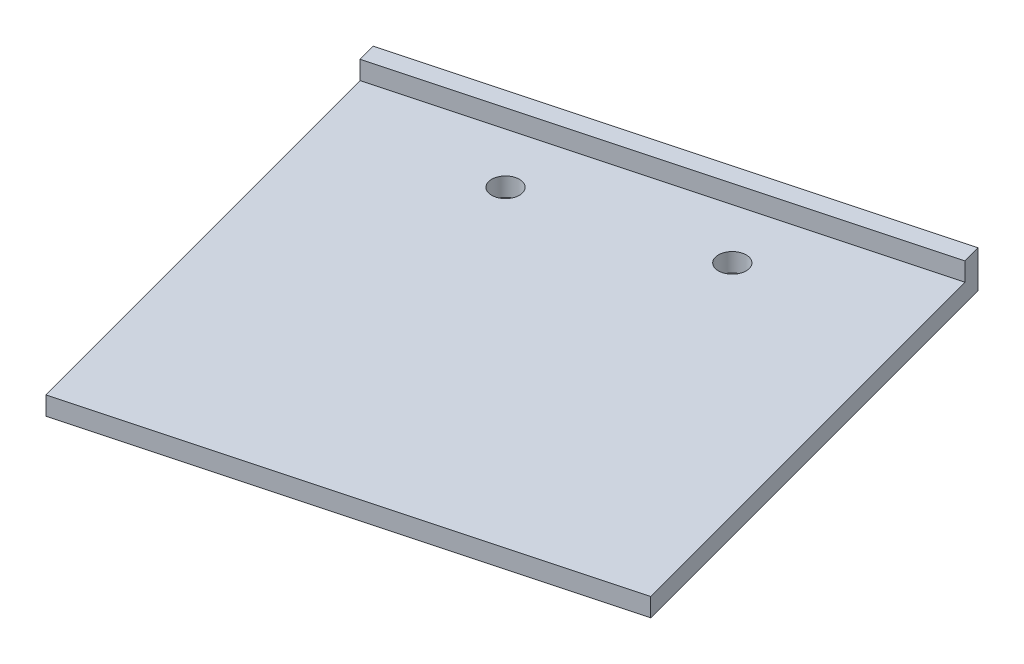
ISO-10303-21;
HEADER;
FILE_DESCRIPTION(('STEP AP214'),'2;1');
FILE_NAME('part.step','',(''),(''),'','','');
FILE_SCHEMA(('AUTOMOTIVE_DESIGN { 1 0 10303 214 1 1 1 1 }'));
ENDSEC;
DATA;
#1=APPLICATION_CONTEXT('core data for automotive mechanical design processes');
#2=APPLICATION_PROTOCOL_DEFINITION('international standard','automotive_design',2000,#1);
#3=PRODUCT_CONTEXT('',#1,'mechanical');
#4=PRODUCT('Part','Part','',(#3));
#5=PRODUCT_RELATED_PRODUCT_CATEGORY('part','',(#4));
#6=PRODUCT_DEFINITION_FORMATION('','',#4);
#7=PRODUCT_DEFINITION_CONTEXT('part definition',#1,'design');
#8=PRODUCT_DEFINITION('design','',#6,#7);
#9=PRODUCT_DEFINITION_SHAPE('','',#8);
#10=(LENGTH_UNIT() NAMED_UNIT(*) SI_UNIT(.MILLI.,.METRE.));
#11=(NAMED_UNIT(*) PLANE_ANGLE_UNIT() SI_UNIT($,.RADIAN.));
#12=(NAMED_UNIT(*) SI_UNIT($,.STERADIAN.) SOLID_ANGLE_UNIT());
#13=UNCERTAINTY_MEASURE_WITH_UNIT(LENGTH_MEASURE(1.E-05),#10,'distance_accuracy_value','');
#14=(GEOMETRIC_REPRESENTATION_CONTEXT(3) GLOBAL_UNCERTAINTY_ASSIGNED_CONTEXT((#13)) GLOBAL_UNIT_ASSIGNED_CONTEXT((#10,
#11,#12)) REPRESENTATION_CONTEXT('',''));
#15=CARTESIAN_POINT('',(0.,0.,0.));
#16=DIRECTION('',(0.,0.,1.));
#17=DIRECTION('',(1.,0.,0.));
#18=AXIS2_PLACEMENT_3D('',#15,#16,#17);
#19=CARTESIAN_POINT('',(-516.1846627745,-1671.01,2925.388423853));
#20=DIRECTION('',(0.,-1.,0.));
#21=DIRECTION('',(0.965925826288944,0.,-0.258819045102985));
#22=AXIS2_PLACEMENT_3D('',#19,#20,#21);
#23=CYLINDRICAL_SURFACE('',#22,4.5);
#24=CARTESIAN_POINT('',(-516.1846627745,-1671.,2925.388423853));
#25=DIRECTION('',(0.,-1.,0.));
#26=DIRECTION('',(0.965925826288944,0.,-0.258819045102985));
#27=AXIS2_PLACEMENT_3D('',#24,#25,#26);
#28=CIRCLE('',#27,4.5);
#29=CARTESIAN_POINT('',(-511.8379965562,-1671.,2924.22373815));
#30=VERTEX_POINT('',#29);
#31=EDGE_CURVE('E164',#30,#30,#28,.T.);
#32=ORIENTED_EDGE('',*,*,#31,.T.);
#33=DIRECTION('',(0.,1.,0.));
#34=VECTOR('',#33,1.);
#35=CARTESIAN_POINT('',(-511.8379965562,-1671.01,2924.22373815));
#36=LINE('',#35,#34);
#37=CARTESIAN_POINT('',(-511.8379965562,-1665.,2924.22373815));
#38=VERTEX_POINT('',#37);
#39=EDGE_CURVE('E11',#30,#38,#36,.T.);
#40=ORIENTED_EDGE('',*,*,#39,.T.);
#41=CARTESIAN_POINT('',(-516.1846627745,-1665.,2925.388423853));
#42=DIRECTION('',(0.,-1.,0.));
#43=DIRECTION('',(0.965925826288944,0.,-0.258819045102985));
#44=AXIS2_PLACEMENT_3D('',#41,#42,#43);
#45=CIRCLE('',#44,4.5);
#46=EDGE_CURVE('E133',#38,#38,#45,.T.);
#47=ORIENTED_EDGE('',*,*,#46,.F.);
#48=ORIENTED_EDGE('',*,*,#39,.F.);
#49=EDGE_LOOP('',(#32,#40,#47,#48));
#50=FACE_BOUND('',#49,.T.);
#51=ADVANCED_FACE('F17',(#50),#23,.F.);
#52=CARTESIAN_POINT('',(-574.1402123519,-1671.01,2940.917566559));
#53=DIRECTION('',(0.,-1.,0.));
#54=DIRECTION('',(0.965925826288944,0.,-0.258819045102985));
#55=AXIS2_PLACEMENT_3D('',#52,#53,#54);
#56=CYLINDRICAL_SURFACE('',#55,4.5);
#57=CARTESIAN_POINT('',(-574.1402123519,-1671.,2940.917566559));
#58=DIRECTION('',(0.,-1.,0.));
#59=DIRECTION('',(0.965925826288944,0.,-0.258819045102985));
#60=AXIS2_PLACEMENT_3D('',#57,#58,#59);
#61=CIRCLE('',#60,4.5);
#62=CARTESIAN_POINT('',(-569.7935461336,-1671.,2939.752880856));
#63=VERTEX_POINT('',#62);
#64=EDGE_CURVE('E185',#63,#63,#61,.T.);
#65=ORIENTED_EDGE('',*,*,#64,.T.);
#66=DIRECTION('',(0.,1.,0.));
#67=VECTOR('',#66,1.);
#68=CARTESIAN_POINT('',(-569.7935461336,-1671.01,2939.752880856));
#69=LINE('',#68,#67);
#70=CARTESIAN_POINT('',(-569.7935461336,-1665.,2939.752880856));
#71=VERTEX_POINT('',#70);
#72=EDGE_CURVE('E20',#63,#71,#69,.T.);
#73=ORIENTED_EDGE('',*,*,#72,.T.);
#74=CARTESIAN_POINT('',(-574.1402123519,-1665.,2940.917566559));
#75=DIRECTION('',(0.,-1.,0.));
#76=DIRECTION('',(0.965925826288944,0.,-0.258819045102985));
#77=AXIS2_PLACEMENT_3D('',#74,#75,#76);
#78=CIRCLE('',#77,4.5);
#79=EDGE_CURVE('E138',#71,#71,#78,.T.);
#80=ORIENTED_EDGE('',*,*,#79,.F.);
#81=ORIENTED_EDGE('',*,*,#72,.F.);
#82=EDGE_LOOP('',(#65,#73,#80,#81));
#83=FACE_BOUND('',#82,.T.);
#84=ADVANCED_FACE('F229',(#83),#56,.F.);
#85=CARTESIAN_POINT('',(-474.6176666327,-1671.,2887.333400114));
#86=DIRECTION('',(0.965925826288944,0.,-0.258819045102985));
#87=DIRECTION('',(0.,-1.,0.));
#88=AXIS2_PLACEMENT_3D('',#85,#86,#87);
#89=PLANE('',#88);
#90=DIRECTION('',(0.258819045102985,0.,0.965925826288944));
#91=VECTOR('',#90,1.);
#92=CARTESIAN_POINT('',(-474.6176666327,-1671.,2887.333400114));
#93=LINE('',#92,#91);
#94=CARTESIAN_POINT('',(-474.6176666327,-1671.,2887.333400114));
#95=VERTEX_POINT('',#94);
#96=CARTESIAN_POINT('',(-435.7948098673,-1671.,3032.222274057));
#97=VERTEX_POINT('',#96);
#98=EDGE_CURVE('E167',#95,#97,#93,.T.);
#99=ORIENTED_EDGE('',*,*,#98,.F.);
#100=DIRECTION('',(0.,-1.,0.));
#101=VECTOR('',#100,1.);
#102=CARTESIAN_POINT('',(-474.6176666327,-1659.,2887.333400114));
#103=LINE('',#102,#101);
#104=CARTESIAN_POINT('',(-474.6176666327,-1659.,2887.333400114));
#105=VERTEX_POINT('',#104);
#106=EDGE_CURVE('E163',#105,#95,#103,.T.);
#107=ORIENTED_EDGE('',*,*,#106,.F.);
#108=DIRECTION('',(0.258819045102985,0.,0.965925826288944));
#109=VECTOR('',#108,1.);
#110=CARTESIAN_POINT('',(-474.6176666327,-1659.,2887.333400114));
#111=LINE('',#110,#109);
#112=CARTESIAN_POINT('',(-473.0647523621,-1659.,2893.128955072));
#113=VERTEX_POINT('',#112);
#114=EDGE_CURVE('E74',#105,#113,#111,.T.);
#115=ORIENTED_EDGE('',*,*,#114,.T.);
#116=DIRECTION('',(0.,1.,0.));
#117=VECTOR('',#116,1.);
#118=CARTESIAN_POINT('',(-473.0647523621,-1665.,2893.128955072));
#119=LINE('',#118,#117);
#120=CARTESIAN_POINT('',(-473.0647523621,-1665.,2893.128955072));
#121=VERTEX_POINT('',#120);
#122=EDGE_CURVE('E60',#121,#113,#119,.T.);
#123=ORIENTED_EDGE('',*,*,#122,.F.);
#124=DIRECTION('',(0.258819045102985,0.,0.965925826288944));
#125=VECTOR('',#124,1.);
#126=CARTESIAN_POINT('',(-474.6176666327,-1665.,2887.333400114));
#127=LINE('',#126,#125);
#128=CARTESIAN_POINT('',(-435.7948098673,-1665.,3032.222274057));
#129=VERTEX_POINT('',#128);
#130=EDGE_CURVE('E134',#121,#129,#127,.T.);
#131=ORIENTED_EDGE('',*,*,#130,.T.);
#132=DIRECTION('',(0.,1.,0.));
#133=VECTOR('',#132,1.);
#134=CARTESIAN_POINT('',(-435.7948098673,-1671.,3032.222274057));
#135=LINE('',#134,#133);
#136=EDGE_CURVE('E121',#97,#129,#135,.T.);
#137=ORIENTED_EDGE('',*,*,#136,.F.);
#138=EDGE_LOOP('',(#99,#107,#115,#123,#131,#137));
#139=FACE_BOUND('',#138,.T.);
#140=ADVANCED_FACE('F135',(#139),#89,.T.);
#141=CARTESIAN_POINT('',(-590.3429420736,-1671.,3073.633321274));
#142=DIRECTION('',(0.258819045102985,0.,0.965925826288944));
#143=DIRECTION('',(0.,-1.,0.));
#144=AXIS2_PLACEMENT_3D('',#141,#142,#143);
#145=PLANE('',#144);
#146=DIRECTION('',(0.,1.,0.));
#147=VECTOR('',#146,1.);
#148=CARTESIAN_POINT('',(-590.3429420736,-1671.,3073.633321274));
#149=LINE('',#148,#147);
#150=CARTESIAN_POINT('',(-590.3429420736,-1671.,3073.633321274));
#151=VERTEX_POINT('',#150);
#152=CARTESIAN_POINT('',(-590.3429420736,-1665.,3073.633321274));
#153=VERTEX_POINT('',#152);
#154=EDGE_CURVE('E154',#151,#153,#149,.T.);
#155=ORIENTED_EDGE('',*,*,#154,.F.);
#156=DIRECTION('',(0.965925826288944,0.,-0.258819045102985));
#157=VECTOR('',#156,1.);
#158=CARTESIAN_POINT('',(-590.3429420736,-1671.,3073.633321274));
#159=LINE('',#158,#157);
#160=EDGE_CURVE('E128',#151,#97,#159,.T.);
#161=ORIENTED_EDGE('',*,*,#160,.T.);
#162=ORIENTED_EDGE('',*,*,#136,.T.);
#163=DIRECTION('',(0.965925826288944,0.,-0.258819045102985));
#164=VECTOR('',#163,1.);
#165=CARTESIAN_POINT('',(-590.3429420736,-1665.,3073.633321274));
#166=LINE('',#165,#164);
#167=EDGE_CURVE('E126',#153,#129,#166,.T.);
#168=ORIENTED_EDGE('',*,*,#167,.F.);
#169=EDGE_LOOP('',(#155,#161,#162,#168));
#170=FACE_BOUND('',#169,.T.);
#171=ADVANCED_FACE('F124',(#170),#145,.T.);
#172=CARTESIAN_POINT('',(-629.165798839,-1665.,2928.74444733));
#173=DIRECTION('',(0.,1.,0.));
#174=DIRECTION('',(1.,0.,0.));
#175=AXIS2_PLACEMENT_3D('',#172,#173,#174);
#176=PLANE('',#175);
#177=ORIENTED_EDGE('',*,*,#46,.T.);
#178=EDGE_LOOP('',(#177));
#179=FACE_BOUND('',#178,.T.);
#180=ORIENTED_EDGE('',*,*,#79,.T.);
#181=EDGE_LOOP('',(#180));
#182=FACE_BOUND('',#181,.T.);
#183=DIRECTION('',(0.965925826288944,0.,-0.258819045102985));
#184=VECTOR('',#183,1.);
#185=CARTESIAN_POINT('',(-627.6128845684,-1665.,2934.540002288));
#186=LINE('',#185,#184);
#187=CARTESIAN_POINT('',(-627.6128845684,-1665.,2934.540002288));
#188=VERTEX_POINT('',#187);
#189=EDGE_CURVE('E150',#188,#121,#186,.T.);
#190=ORIENTED_EDGE('',*,*,#189,.F.);
#191=DIRECTION('',(0.258819045102985,0.,0.965925826288944));
#192=VECTOR('',#191,1.);
#193=CARTESIAN_POINT('',(-629.165798839,-1665.,2928.74444733));
#194=LINE('',#193,#192);
#195=EDGE_CURVE('E142',#188,#153,#194,.T.);
#196=ORIENTED_EDGE('',*,*,#195,.T.);
#197=ORIENTED_EDGE('',*,*,#167,.T.);
#198=ORIENTED_EDGE('',*,*,#130,.F.);
#199=EDGE_LOOP('',(#190,#196,#197,#198));
#200=FACE_BOUND('',#199,.T.);
#201=ADVANCED_FACE('F140',(#179,#182,#200),#176,.T.);
#202=CARTESIAN_POINT('',(-627.6128845684,-1665.,2934.540002288));
#203=DIRECTION('',(0.258819045102985,0.,0.965925826288944));
#204=DIRECTION('',(0.,-1.,0.));
#205=AXIS2_PLACEMENT_3D('',#202,#203,#204);
#206=PLANE('',#205);
#207=DIRECTION('',(0.,1.,0.));
#208=VECTOR('',#207,1.);
#209=CARTESIAN_POINT('',(-627.6128845684,-1665.,2934.540002288));
#210=LINE('',#209,#208);
#211=CARTESIAN_POINT('',(-627.6128845684,-1659.,2934.540002288));
#212=VERTEX_POINT('',#211);
#213=EDGE_CURVE('E156',#188,#212,#210,.T.);
#214=ORIENTED_EDGE('',*,*,#213,.F.);
#215=ORIENTED_EDGE('',*,*,#189,.T.);
#216=ORIENTED_EDGE('',*,*,#122,.T.);
#217=DIRECTION('',(0.965925826288944,0.,-0.258819045102985));
#218=VECTOR('',#217,1.);
#219=CARTESIAN_POINT('',(-627.6128845684,-1659.,2934.540002288));
#220=LINE('',#219,#218);
#221=EDGE_CURVE('E100',#212,#113,#220,.T.);
#222=ORIENTED_EDGE('',*,*,#221,.F.);
#223=EDGE_LOOP('',(#214,#215,#216,#222));
#224=FACE_BOUND('',#223,.T.);
#225=ADVANCED_FACE('F217',(#224),#206,.T.);
#226=CARTESIAN_POINT('',(-629.165798839,-1659.,2928.74444733));
#227=DIRECTION('',(0.,1.,0.));
#228=DIRECTION('',(1.,0.,0.));
#229=AXIS2_PLACEMENT_3D('',#226,#227,#228);
#230=PLANE('',#229);
#231=DIRECTION('',(0.965925826288944,0.,-0.258819045102985));
#232=VECTOR('',#231,1.);
#233=CARTESIAN_POINT('',(-629.165798839,-1659.,2928.74444733));
#234=LINE('',#233,#232);
#235=CARTESIAN_POINT('',(-629.165798839,-1659.,2928.74444733));
#236=VERTEX_POINT('',#235);
#237=EDGE_CURVE('E95',#236,#105,#234,.T.);
#238=ORIENTED_EDGE('',*,*,#237,.F.);
#239=DIRECTION('',(0.258819045102985,0.,0.965925826288944));
#240=VECTOR('',#239,1.);
#241=CARTESIAN_POINT('',(-629.165798839,-1659.,2928.74444733));
#242=LINE('',#241,#240);
#243=EDGE_CURVE('E160',#236,#212,#242,.T.);
#244=ORIENTED_EDGE('',*,*,#243,.T.);
#245=ORIENTED_EDGE('',*,*,#221,.T.);
#246=ORIENTED_EDGE('',*,*,#114,.F.);
#247=EDGE_LOOP('',(#238,#244,#245,#246));
#248=FACE_BOUND('',#247,.T.);
#249=ADVANCED_FACE('F215',(#248),#230,.T.);
#250=CARTESIAN_POINT('',(-629.165798839,-1671.,2928.74444733));
#251=DIRECTION('',(0.258819045102985,0.,0.965925826288944));
#252=DIRECTION('',(0.,-1.,0.));
#253=AXIS2_PLACEMENT_3D('',#250,#251,#252);
#254=PLANE('',#253);
#255=DIRECTION('',(0.,-1.,0.));
#256=VECTOR('',#255,1.);
#257=CARTESIAN_POINT('',(-629.165798839,-1659.,2928.74444733));
#258=LINE('',#257,#256);
#259=CARTESIAN_POINT('',(-629.165798839,-1671.,2928.74444733));
#260=VERTEX_POINT('',#259);
#261=EDGE_CURVE('E170',#236,#260,#258,.T.);
#262=ORIENTED_EDGE('',*,*,#261,.F.);
#263=ORIENTED_EDGE('',*,*,#237,.T.);
#264=ORIENTED_EDGE('',*,*,#106,.T.);
#265=DIRECTION('',(0.965925826288944,0.,-0.258819045102985));
#266=VECTOR('',#265,1.);
#267=CARTESIAN_POINT('',(-629.165798839,-1671.,2928.74444733));
#268=LINE('',#267,#266);
#269=EDGE_CURVE('E88',#260,#95,#268,.T.);
#270=ORIENTED_EDGE('',*,*,#269,.F.);
#271=EDGE_LOOP('',(#262,#263,#264,#270));
#272=FACE_BOUND('',#271,.T.);
#273=ADVANCED_FACE('F209',(#272),#254,.F.);
#274=CARTESIAN_POINT('',(-629.165798839,-1671.,2928.74444733));
#275=DIRECTION('',(0.,1.,0.));
#276=DIRECTION('',(1.,0.,0.));
#277=AXIS2_PLACEMENT_3D('',#274,#275,#276);
#278=PLANE('',#277);
#279=ORIENTED_EDGE('',*,*,#31,.F.);
#280=EDGE_LOOP('',(#279));
#281=FACE_BOUND('',#280,.T.);
#282=ORIENTED_EDGE('',*,*,#64,.F.);
#283=EDGE_LOOP('',(#282));
#284=FACE_BOUND('',#283,.T.);
#285=ORIENTED_EDGE('',*,*,#98,.T.);
#286=ORIENTED_EDGE('',*,*,#160,.F.);
#287=DIRECTION('',(0.258819045102985,0.,0.965925826288944));
#288=VECTOR('',#287,1.);
#289=CARTESIAN_POINT('',(-629.165798839,-1671.,2928.74444733));
#290=LINE('',#289,#288);
#291=EDGE_CURVE('E176',#260,#151,#290,.T.);
#292=ORIENTED_EDGE('',*,*,#291,.F.);
#293=ORIENTED_EDGE('',*,*,#269,.T.);
#294=EDGE_LOOP('',(#285,#286,#292,#293));
#295=FACE_BOUND('',#294,.T.);
#296=ADVANCED_FACE('F205',(#281,#284,#295),#278,.F.);
#297=CARTESIAN_POINT('',(-629.165798839,-1671.,2928.74444733));
#298=DIRECTION('',(0.965925826288944,0.,-0.258819045102985));
#299=DIRECTION('',(0.,-1.,0.));
#300=AXIS2_PLACEMENT_3D('',#297,#298,#299);
#301=PLANE('',#300);
#302=ORIENTED_EDGE('',*,*,#154,.T.);
#303=ORIENTED_EDGE('',*,*,#195,.F.);
#304=ORIENTED_EDGE('',*,*,#213,.T.);
#305=ORIENTED_EDGE('',*,*,#243,.F.);
#306=ORIENTED_EDGE('',*,*,#261,.T.);
#307=ORIENTED_EDGE('',*,*,#291,.T.);
#308=EDGE_LOOP('',(#302,#303,#304,#305,#306,#307));
#309=FACE_BOUND('',#308,.T.);
#310=ADVANCED_FACE('F208',(#309),#301,.F.);
#311=CLOSED_SHELL('',(#51,#84,#140,#171,#201,#225,#249,#273,#296,#310));
#312=MANIFOLD_SOLID_BREP('B1',#311);
#313=ADVANCED_BREP_SHAPE_REPRESENTATION('',(#18,#312),#14);
#314=SHAPE_DEFINITION_REPRESENTATION(#9,#313);
ENDSEC;
END-ISO-10303-21;
